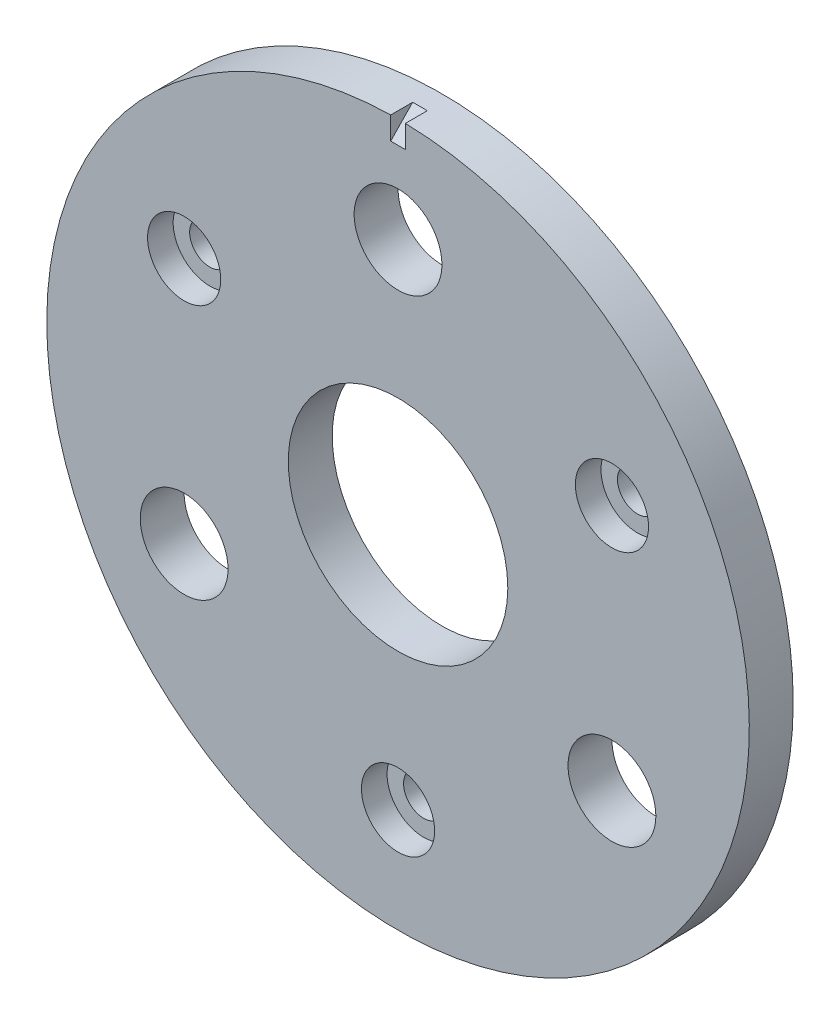
ISO-10303-21;
HEADER;
FILE_DESCRIPTION(('STEP AP214'),'2;1');
FILE_NAME('part.step','',(''),(''),'','','');
FILE_SCHEMA(('AUTOMOTIVE_DESIGN { 1 0 10303 214 1 1 1 1 }'));
ENDSEC;
DATA;
#1=APPLICATION_CONTEXT('core data for automotive mechanical design processes');
#2=APPLICATION_PROTOCOL_DEFINITION('international standard','automotive_design',2000,#1);
#3=PRODUCT_CONTEXT('',#1,'mechanical');
#4=PRODUCT('Part','Part','',(#3));
#5=PRODUCT_RELATED_PRODUCT_CATEGORY('part','',(#4));
#6=PRODUCT_DEFINITION_FORMATION('','',#4);
#7=PRODUCT_DEFINITION_CONTEXT('part definition',#1,'design');
#8=PRODUCT_DEFINITION('design','',#6,#7);
#9=PRODUCT_DEFINITION_SHAPE('','',#8);
#10=(LENGTH_UNIT() NAMED_UNIT(*) SI_UNIT(.MILLI.,.METRE.));
#11=(NAMED_UNIT(*) PLANE_ANGLE_UNIT() SI_UNIT($,.RADIAN.));
#12=(NAMED_UNIT(*) SI_UNIT($,.STERADIAN.) SOLID_ANGLE_UNIT());
#13=UNCERTAINTY_MEASURE_WITH_UNIT(LENGTH_MEASURE(1.E-05),#10,'distance_accuracy_value','');
#14=(GEOMETRIC_REPRESENTATION_CONTEXT(3) GLOBAL_UNCERTAINTY_ASSIGNED_CONTEXT((#13)) GLOBAL_UNIT_ASSIGNED_CONTEXT((#10,
#11,#12)) REPRESENTATION_CONTEXT('',''));
#15=CARTESIAN_POINT('',(0.,0.,0.));
#16=DIRECTION('',(0.,0.,1.));
#17=DIRECTION('',(1.,0.,0.));
#18=AXIS2_PLACEMENT_3D('',#15,#16,#17);
#19=CARTESIAN_POINT('',(0.,-33.75,3.16530031758062));
#20=DIRECTION('',(0.,0.,-1.));
#21=DIRECTION('',(-1.,0.,0.));
#22=AXIS2_PLACEMENT_3D('',#19,#20,#21);
#23=CYLINDRICAL_SURFACE('',#22,2.75);
#24=CARTESIAN_POINT('',(0.,-33.75,-3.));
#25=DIRECTION('',(0.,0.,1.));
#26=DIRECTION('',(1.,0.,0.));
#27=AXIS2_PLACEMENT_3D('',#24,#25,#26);
#28=CIRCLE('',#27,2.75);
#29=CARTESIAN_POINT('',(2.75,-33.75,-3.));
#30=VERTEX_POINT('',#29);
#31=EDGE_CURVE('E199',#30,#30,#28,.T.);
#32=ORIENTED_EDGE('',*,*,#31,.F.);
#33=EDGE_LOOP('',(#32));
#34=FACE_BOUND('',#33,.T.);
#35=CARTESIAN_POINT('',(0.,-33.75,-0.5));
#36=DIRECTION('',(0.,0.,1.));
#37=DIRECTION('',(1.,0.,0.));
#38=AXIS2_PLACEMENT_3D('',#35,#36,#37);
#39=CIRCLE('',#38,2.75);
#40=CARTESIAN_POINT('',(2.75,-33.75,-0.5));
#41=VERTEX_POINT('',#40);
#42=EDGE_CURVE('E44',#41,#41,#39,.T.);
#43=ORIENTED_EDGE('',*,*,#42,.T.);
#44=EDGE_LOOP('',(#43));
#45=FACE_BOUND('',#44,.T.);
#46=ADVANCED_FACE('F41',(#34,#45),#23,.F.);
#47=CARTESIAN_POINT('',(-29.228,16.875,3.16530031758062));
#48=DIRECTION('',(0.,0.,-1.));
#49=DIRECTION('',(-1.,0.,0.));
#50=AXIS2_PLACEMENT_3D('',#47,#48,#49);
#51=CYLINDRICAL_SURFACE('',#50,2.75);
#52=CARTESIAN_POINT('',(-29.228,16.875,-3.));
#53=DIRECTION('',(0.,0.,1.));
#54=DIRECTION('',(1.,0.,0.));
#55=AXIS2_PLACEMENT_3D('',#52,#53,#54);
#56=CIRCLE('',#55,2.75);
#57=CARTESIAN_POINT('',(-26.478,16.875,-3.));
#58=VERTEX_POINT('',#57);
#59=EDGE_CURVE('E182',#58,#58,#56,.T.);
#60=ORIENTED_EDGE('',*,*,#59,.F.);
#61=EDGE_LOOP('',(#60));
#62=FACE_BOUND('',#61,.T.);
#63=CARTESIAN_POINT('',(-29.228,16.875,-0.5));
#64=DIRECTION('',(0.,0.,1.));
#65=DIRECTION('',(1.,0.,0.));
#66=AXIS2_PLACEMENT_3D('',#63,#64,#65);
#67=CIRCLE('',#66,2.75);
#68=CARTESIAN_POINT('',(-26.478,16.875,-0.5));
#69=VERTEX_POINT('',#68);
#70=EDGE_CURVE('E172',#69,#69,#67,.T.);
#71=ORIENTED_EDGE('',*,*,#70,.T.);
#72=EDGE_LOOP('',(#71));
#73=FACE_BOUND('',#72,.T.);
#74=ADVANCED_FACE('F222',(#62,#73),#51,.F.);
#75=CARTESIAN_POINT('',(29.228,16.875,3.16530031758062));
#76=DIRECTION('',(0.,0.,-1.));
#77=DIRECTION('',(-1.,0.,0.));
#78=AXIS2_PLACEMENT_3D('',#75,#76,#77);
#79=CYLINDRICAL_SURFACE('',#78,2.75);
#80=CARTESIAN_POINT('',(29.228,16.875,-3.));
#81=DIRECTION('',(0.,0.,1.));
#82=DIRECTION('',(1.,0.,0.));
#83=AXIS2_PLACEMENT_3D('',#80,#81,#82);
#84=CIRCLE('',#83,2.75);
#85=CARTESIAN_POINT('',(31.978,16.875,-3.));
#86=VERTEX_POINT('',#85);
#87=EDGE_CURVE('E186',#86,#86,#84,.T.);
#88=ORIENTED_EDGE('',*,*,#87,.F.);
#89=EDGE_LOOP('',(#88));
#90=FACE_BOUND('',#89,.T.);
#91=CARTESIAN_POINT('',(29.228,16.875,-0.5));
#92=DIRECTION('',(0.,0.,1.));
#93=DIRECTION('',(1.,0.,0.));
#94=AXIS2_PLACEMENT_3D('',#91,#92,#93);
#95=CIRCLE('',#94,2.75);
#96=CARTESIAN_POINT('',(31.978,16.875,-0.5));
#97=VERTEX_POINT('',#96);
#98=EDGE_CURVE('E171',#97,#97,#95,.T.);
#99=ORIENTED_EDGE('',*,*,#98,.T.);
#100=EDGE_LOOP('',(#99));
#101=FACE_BOUND('',#100,.T.);
#102=ADVANCED_FACE('F147',(#90,#101),#79,.F.);
#103=CARTESIAN_POINT('',(0.,0.,3.));
#104=DIRECTION('',(0.,0.,1.));
#105=DIRECTION('',(1.,0.,0.));
#106=AXIS2_PLACEMENT_3D('',#103,#104,#105);
#107=PLANE('',#106);
#108=CARTESIAN_POINT('',(0.,-33.75,3.));
#109=DIRECTION('',(0.,0.,1.));
#110=DIRECTION('',(1.,0.,0.));
#111=AXIS2_PLACEMENT_3D('',#108,#109,#110);
#112=CIRCLE('',#111,5.);
#113=CARTESIAN_POINT('',(5.,-33.75,3.));
#114=VERTEX_POINT('',#113);
#115=EDGE_CURVE('E379',#114,#114,#112,.T.);
#116=ORIENTED_EDGE('',*,*,#115,.F.);
#117=EDGE_LOOP('',(#116));
#118=FACE_BOUND('',#117,.T.);
#119=CARTESIAN_POINT('',(29.228,16.875,3.));
#120=DIRECTION('',(0.,0.,1.));
#121=DIRECTION('',(1.,0.,0.));
#122=AXIS2_PLACEMENT_3D('',#119,#120,#121);
#123=CIRCLE('',#122,5.);
#124=CARTESIAN_POINT('',(34.228,16.875,3.));
#125=VERTEX_POINT('',#124);
#126=EDGE_CURVE('E383',#125,#125,#123,.T.);
#127=ORIENTED_EDGE('',*,*,#126,.F.);
#128=EDGE_LOOP('',(#127));
#129=FACE_BOUND('',#128,.T.);
#130=CARTESIAN_POINT('',(-29.228,16.875,3.));
#131=DIRECTION('',(0.,0.,1.));
#132=DIRECTION('',(1.,0.,0.));
#133=AXIS2_PLACEMENT_3D('',#130,#131,#132);
#134=CIRCLE('',#133,5.);
#135=CARTESIAN_POINT('',(-24.228,16.875,3.));
#136=VERTEX_POINT('',#135);
#137=EDGE_CURVE('E392',#136,#136,#134,.T.);
#138=ORIENTED_EDGE('',*,*,#137,.F.);
#139=EDGE_LOOP('',(#138));
#140=FACE_BOUND('',#139,.T.);
#141=CARTESIAN_POINT('',(0.,0.,3.));
#142=DIRECTION('',(0.,0.,1.));
#143=DIRECTION('',(1.,0.,0.));
#144=AXIS2_PLACEMENT_3D('',#141,#142,#143);
#145=CIRCLE('',#144,15.);
#146=CARTESIAN_POINT('',(15.,0.,3.));
#147=VERTEX_POINT('',#146);
#148=EDGE_CURVE('E168',#147,#147,#145,.F.);
#149=ORIENTED_EDGE('',*,*,#148,.T.);
#150=EDGE_LOOP('',(#149));
#151=FACE_BOUND('',#150,.T.);
#152=CARTESIAN_POINT('',(-29.2283573777247,-16.8750000000001,3.));
#153=DIRECTION('',(0.,0.,1.));
#154=DIRECTION('',(1.,0.,0.));
#155=AXIS2_PLACEMENT_3D('',#152,#153,#154);
#156=CIRCLE('',#155,6.);
#157=CARTESIAN_POINT('',(-23.2283573777247,-16.8750000000001,3.));
#158=VERTEX_POINT('',#157);
#159=EDGE_CURVE('E113',#158,#158,#156,.T.);
#160=ORIENTED_EDGE('',*,*,#159,.F.);
#161=EDGE_LOOP('',(#160));
#162=FACE_BOUND('',#161,.T.);
#163=CARTESIAN_POINT('',(29.228357377725,-16.8749999999997,3.));
#164=DIRECTION('',(0.,0.,1.));
#165=DIRECTION('',(1.,0.,0.));
#166=AXIS2_PLACEMENT_3D('',#163,#164,#165);
#167=CIRCLE('',#166,6.);
#168=CARTESIAN_POINT('',(35.228357377725,-16.8749999999997,3.));
#169=VERTEX_POINT('',#168);
#170=EDGE_CURVE('E108',#169,#169,#167,.T.);
#171=ORIENTED_EDGE('',*,*,#170,.F.);
#172=EDGE_LOOP('',(#171));
#173=FACE_BOUND('',#172,.T.);
#174=CARTESIAN_POINT('',(0.,33.75,3.000012));
#175=DIRECTION('',(0.,0.,1.));
#176=DIRECTION('',(1.,0.,0.));
#177=AXIS2_PLACEMENT_3D('',#174,#175,#176);
#178=CIRCLE('',#177,6.);
#179=CARTESIAN_POINT('',(6.,33.75,3.000012));
#180=VERTEX_POINT('',#179);
#181=EDGE_CURVE('E120',#180,#180,#178,.T.);
#182=ORIENTED_EDGE('',*,*,#181,.F.);
#183=EDGE_LOOP('',(#182));
#184=FACE_BOUND('',#183,.T.);
#185=CARTESIAN_POINT('',(0.,0.,3.));
#186=DIRECTION('',(0.,0.,1.));
#187=DIRECTION('',(1.,0.,0.));
#188=AXIS2_PLACEMENT_3D('',#185,#186,#187);
#189=CIRCLE('',#188,48.);
#190=CARTESIAN_POINT('',(-0.999999999999999,47.9895822028073,3.));
#191=VERTEX_POINT('',#190);
#192=CARTESIAN_POINT('',(1.,47.9895822028073,3.));
#193=VERTEX_POINT('',#192);
#194=EDGE_CURVE('E134',#191,#193,#189,.T.);
#195=ORIENTED_EDGE('',*,*,#194,.T.);
#196=DIRECTION('',(0.,-1.,0.));
#197=VECTOR('',#196,1.);
#198=CARTESIAN_POINT('',(1.,44.8892530056158,3.));
#199=LINE('',#198,#197);
#200=CARTESIAN_POINT('',(1.,44.8892530056158,3.));
#201=VERTEX_POINT('',#200);
#202=EDGE_CURVE('E56',#193,#201,#199,.T.);
#203=ORIENTED_EDGE('',*,*,#202,.T.);
#204=DIRECTION('',(1.,0.,0.));
#205=VECTOR('',#204,1.);
#206=CARTESIAN_POINT('',(-0.999999999999995,44.8892530056158,3.));
#207=LINE('',#206,#205);
#208=CARTESIAN_POINT('',(-0.999999999999995,44.8892530056158,3.));
#209=VERTEX_POINT('',#208);
#210=EDGE_CURVE('E87',#209,#201,#207,.T.);
#211=ORIENTED_EDGE('',*,*,#210,.F.);
#212=DIRECTION('',(0.,-1.,0.));
#213=VECTOR('',#212,1.);
#214=CARTESIAN_POINT('',(-0.999999999999995,44.8892530056158,3.));
#215=LINE('',#214,#213);
#216=EDGE_CURVE('E77',#191,#209,#215,.T.);
#217=ORIENTED_EDGE('',*,*,#216,.F.);
#218=EDGE_LOOP('',(#195,#203,#211,#217));
#219=FACE_BOUND('',#218,.T.);
#220=ADVANCED_FACE('F94',(#118,#129,#140,#151,#162,#173,#184,#219),#107,.T.);
#221=CARTESIAN_POINT('',(0.,0.,-3.));
#222=DIRECTION('',(0.,0.,1.));
#223=DIRECTION('',(1.,0.,0.));
#224=AXIS2_PLACEMENT_3D('',#221,#222,#223);
#225=PLANE('',#224);
#226=ORIENTED_EDGE('',*,*,#87,.T.);
#227=EDGE_LOOP('',(#226));
#228=FACE_BOUND('',#227,.T.);
#229=ORIENTED_EDGE('',*,*,#59,.T.);
#230=EDGE_LOOP('',(#229));
#231=FACE_BOUND('',#230,.T.);
#232=CARTESIAN_POINT('',(0.,0.,-3.));
#233=DIRECTION('',(0.,0.,1.));
#234=DIRECTION('',(1.,0.,0.));
#235=AXIS2_PLACEMENT_3D('',#232,#233,#234);
#236=CIRCLE('',#235,15.);
#237=CARTESIAN_POINT('',(15.,0.,-3.));
#238=VERTEX_POINT('',#237);
#239=EDGE_CURVE('E167',#238,#238,#236,.T.);
#240=ORIENTED_EDGE('',*,*,#239,.T.);
#241=EDGE_LOOP('',(#240));
#242=FACE_BOUND('',#241,.T.);
#243=ORIENTED_EDGE('',*,*,#31,.T.);
#244=EDGE_LOOP('',(#243));
#245=FACE_BOUND('',#244,.T.);
#246=CARTESIAN_POINT('',(-29.2283573777247,-16.8750000000001,-3.));
#247=DIRECTION('',(0.,0.,1.));
#248=DIRECTION('',(-0.500000000000004,0.866025403784437,0.));
#249=AXIS2_PLACEMENT_3D('',#246,#247,#248);
#250=CIRCLE('',#249,6.);
#251=CARTESIAN_POINT('',(-32.2283573777248,-11.6788475772935,-3.));
#252=VERTEX_POINT('',#251);
#253=EDGE_CURVE('E103',#252,#252,#250,.T.);
#254=ORIENTED_EDGE('',*,*,#253,.T.);
#255=EDGE_LOOP('',(#254));
#256=FACE_BOUND('',#255,.T.);
#257=CARTESIAN_POINT('',(29.228357377725,-16.8749999999997,-3.));
#258=DIRECTION('',(0.,0.,1.));
#259=DIRECTION('',(-0.499999999999992,-0.866025403784444,0.));
#260=AXIS2_PLACEMENT_3D('',#257,#258,#259);
#261=CIRCLE('',#260,6.);
#262=CARTESIAN_POINT('',(26.228357377725,-22.0711524227064,-3.));
#263=VERTEX_POINT('',#262);
#264=EDGE_CURVE('E98',#263,#263,#261,.T.);
#265=ORIENTED_EDGE('',*,*,#264,.T.);
#266=EDGE_LOOP('',(#265));
#267=FACE_BOUND('',#266,.T.);
#268=CARTESIAN_POINT('',(0.,33.75,-3.));
#269=DIRECTION('',(0.,0.,1.));
#270=DIRECTION('',(1.,0.,0.));
#271=AXIS2_PLACEMENT_3D('',#268,#269,#270);
#272=CIRCLE('',#271,6.);
#273=CARTESIAN_POINT('',(6.,33.75,-3.));
#274=VERTEX_POINT('',#273);
#275=EDGE_CURVE('E117',#274,#274,#272,.T.);
#276=ORIENTED_EDGE('',*,*,#275,.T.);
#277=EDGE_LOOP('',(#276));
#278=FACE_BOUND('',#277,.T.);
#279=CARTESIAN_POINT('',(0.,0.,-3.));
#280=DIRECTION('',(0.,0.,1.));
#281=DIRECTION('',(1.,0.,0.));
#282=AXIS2_PLACEMENT_3D('',#279,#280,#281);
#283=CIRCLE('',#282,48.);
#284=CARTESIAN_POINT('',(48.,0.,-3.));
#285=VERTEX_POINT('',#284);
#286=EDGE_CURVE('E125',#285,#285,#283,.T.);
#287=ORIENTED_EDGE('',*,*,#286,.F.);
#288=EDGE_LOOP('',(#287));
#289=FACE_BOUND('',#288,.T.);
#290=ADVANCED_FACE('F146',(#228,#231,#242,#245,#256,#267,#278,#289),#225,.F.);
#291=CARTESIAN_POINT('',(0.,0.,3.));
#292=DIRECTION('',(0.,0.,-1.));
#293=DIRECTION('',(-1.,0.,0.));
#294=AXIS2_PLACEMENT_3D('',#291,#292,#293);
#295=CYLINDRICAL_SURFACE('',#294,48.);
#296=DIRECTION('',(0.,0.,-1.));
#297=VECTOR('',#296,1.);
#298=CARTESIAN_POINT('',(-0.999999999999999,47.9895822028073,3.));
#299=LINE('',#298,#297);
#300=CARTESIAN_POINT('',(-1.,47.9895822028073,0.010046908872529));
#301=VERTEX_POINT('',#300);
#302=EDGE_CURVE('E11',#301,#191,#299,.F.);
#303=ORIENTED_EDGE('',*,*,#302,.F.);
#304=CARTESIAN_POINT('',(0.,0.,46.2911320849816));
#305=DIRECTION('',(0.,-0.694177668503908,-0.719803698622395));
#306=DIRECTION('',(0.,0.719803698622395,-0.694177668503907));
#307=AXIS2_PLACEMENT_3D('',#304,#305,#306);
#308=ELLIPSE('',#307,66.6848476770339,48.);
#309=CARTESIAN_POINT('',(0.999999999999998,47.9895822028073,0.010046908872529));
#310=VERTEX_POINT('',#309);
#311=EDGE_CURVE('E51',#301,#310,#308,.T.);
#312=ORIENTED_EDGE('',*,*,#311,.T.);
#313=DIRECTION('',(0.,0.,-1.));
#314=VECTOR('',#313,1.);
#315=CARTESIAN_POINT('',(1.,47.9895822028073,3.));
#316=LINE('',#315,#314);
#317=EDGE_CURVE('E158',#310,#193,#316,.F.);
#318=ORIENTED_EDGE('',*,*,#317,.T.);
#319=ORIENTED_EDGE('',*,*,#194,.F.);
#320=EDGE_LOOP('',(#303,#312,#318,#319));
#321=FACE_BOUND('',#320,.T.);
#322=ORIENTED_EDGE('',*,*,#286,.T.);
#323=EDGE_LOOP('',(#322));
#324=FACE_BOUND('',#323,.T.);
#325=ADVANCED_FACE('F43',(#321,#324),#295,.T.);
#326=CARTESIAN_POINT('',(0.,33.75,-3.));
#327=DIRECTION('',(0.,0.,1.));
#328=DIRECTION('',(1.,0.,0.));
#329=AXIS2_PLACEMENT_3D('',#326,#327,#328);
#330=CYLINDRICAL_SURFACE('',#329,6.);
#331=ORIENTED_EDGE('',*,*,#275,.F.);
#332=EDGE_LOOP('',(#331));
#333=FACE_BOUND('',#332,.T.);
#334=ORIENTED_EDGE('',*,*,#181,.T.);
#335=EDGE_LOOP('',(#334));
#336=FACE_BOUND('',#335,.T.);
#337=ADVANCED_FACE('F135',(#333,#336),#330,.F.);
#338=CARTESIAN_POINT('',(29.228357377725,-16.8749999999997,-3.));
#339=DIRECTION('',(0.,0.,1.));
#340=DIRECTION('',(1.,0.,0.));
#341=AXIS2_PLACEMENT_3D('',#338,#339,#340);
#342=CYLINDRICAL_SURFACE('',#341,6.);
#343=ORIENTED_EDGE('',*,*,#170,.T.);
#344=EDGE_LOOP('',(#343));
#345=FACE_BOUND('',#344,.T.);
#346=ORIENTED_EDGE('',*,*,#264,.F.);
#347=EDGE_LOOP('',(#346));
#348=FACE_BOUND('',#347,.T.);
#349=ADVANCED_FACE('F141',(#345,#348),#342,.F.);
#350=CARTESIAN_POINT('',(-29.2283573777247,-16.8750000000001,-3.));
#351=DIRECTION('',(0.,0.,1.));
#352=DIRECTION('',(1.,0.,0.));
#353=AXIS2_PLACEMENT_3D('',#350,#351,#352);
#354=CYLINDRICAL_SURFACE('',#353,6.);
#355=ORIENTED_EDGE('',*,*,#159,.T.);
#356=EDGE_LOOP('',(#355));
#357=FACE_BOUND('',#356,.T.);
#358=ORIENTED_EDGE('',*,*,#253,.F.);
#359=EDGE_LOOP('',(#358));
#360=FACE_BOUND('',#359,.T.);
#361=ADVANCED_FACE('F242',(#357,#360),#354,.F.);
#362=CARTESIAN_POINT('',(-1.,48.,0.));
#363=DIRECTION('',(0.,-0.694177668503908,-0.719803698622395));
#364=DIRECTION('',(0.,0.719803698622395,-0.694177668503907));
#365=AXIS2_PLACEMENT_3D('',#362,#363,#364);
#366=PLANE('',#365);
#367=ORIENTED_EDGE('',*,*,#311,.F.);
#368=DIRECTION('',(0.,0.719803698622395,-0.694177668503907));
#369=VECTOR('',#368,1.);
#370=CARTESIAN_POINT('',(-1.,48.,0.));
#371=LINE('',#370,#369);
#372=EDGE_CURVE('E79',#209,#301,#371,.T.);
#373=ORIENTED_EDGE('',*,*,#372,.F.);
#374=ORIENTED_EDGE('',*,*,#210,.T.);
#375=DIRECTION('',(0.,0.719803698622395,-0.694177668503907));
#376=VECTOR('',#375,1.);
#377=CARTESIAN_POINT('',(0.999999999999998,48.,0.));
#378=LINE('',#377,#376);
#379=EDGE_CURVE('E84',#201,#310,#378,.T.);
#380=ORIENTED_EDGE('',*,*,#379,.T.);
#381=EDGE_LOOP('',(#367,#373,#374,#380));
#382=FACE_BOUND('',#381,.T.);
#383=ADVANCED_FACE('F90',(#382),#366,.F.);
#384=CARTESIAN_POINT('',(-1.,0.,0.));
#385=DIRECTION('',(1.,0.,0.));
#386=DIRECTION('',(0.,0.,-1.));
#387=AXIS2_PLACEMENT_3D('',#384,#385,#386);
#388=PLANE('',#387);
#389=ORIENTED_EDGE('',*,*,#302,.T.);
#390=ORIENTED_EDGE('',*,*,#216,.T.);
#391=ORIENTED_EDGE('',*,*,#372,.T.);
#392=EDGE_LOOP('',(#389,#390,#391));
#393=FACE_BOUND('',#392,.T.);
#394=ADVANCED_FACE('F76',(#393),#388,.T.);
#395=CARTESIAN_POINT('',(1.,0.,0.));
#396=DIRECTION('',(1.,0.,0.));
#397=DIRECTION('',(0.,0.,-1.));
#398=AXIS2_PLACEMENT_3D('',#395,#396,#397);
#399=PLANE('',#398);
#400=ORIENTED_EDGE('',*,*,#379,.F.);
#401=ORIENTED_EDGE('',*,*,#202,.F.);
#402=ORIENTED_EDGE('',*,*,#317,.F.);
#403=EDGE_LOOP('',(#400,#401,#402));
#404=FACE_BOUND('',#403,.T.);
#405=ADVANCED_FACE('F239',(#404),#399,.F.);
#406=CARTESIAN_POINT('',(0.,0.,3.16530031758062));
#407=DIRECTION('',(0.,0.,-1.));
#408=DIRECTION('',(-1.,0.,0.));
#409=AXIS2_PLACEMENT_3D('',#406,#407,#408);
#410=CYLINDRICAL_SURFACE('',#409,15.);
#411=ORIENTED_EDGE('',*,*,#148,.F.);
#412=EDGE_LOOP('',(#411));
#413=FACE_BOUND('',#412,.T.);
#414=ORIENTED_EDGE('',*,*,#239,.F.);
#415=EDGE_LOOP('',(#414));
#416=FACE_BOUND('',#415,.T.);
#417=ADVANCED_FACE('F240',(#413,#416),#410,.F.);
#418=CARTESIAN_POINT('',(29.228,16.875,-0.5));
#419=DIRECTION('',(0.,0.,1.));
#420=DIRECTION('',(1.,0.,0.));
#421=AXIS2_PLACEMENT_3D('',#418,#419,#420);
#422=CYLINDRICAL_SURFACE('',#421,5.);
#423=CARTESIAN_POINT('',(29.228,16.875,-0.5));
#424=DIRECTION('',(0.,0.,1.));
#425=DIRECTION('',(1.,0.,0.));
#426=AXIS2_PLACEMENT_3D('',#423,#424,#425);
#427=CIRCLE('',#426,5.);
#428=CARTESIAN_POINT('',(34.228,16.875,-0.5));
#429=VERTEX_POINT('',#428);
#430=EDGE_CURVE('E394',#429,#429,#427,.T.);
#431=ORIENTED_EDGE('',*,*,#430,.F.);
#432=EDGE_LOOP('',(#431));
#433=FACE_BOUND('',#432,.T.);
#434=ORIENTED_EDGE('',*,*,#126,.T.);
#435=EDGE_LOOP('',(#434));
#436=FACE_BOUND('',#435,.T.);
#437=ADVANCED_FACE('F310',(#433,#436),#422,.F.);
#438=CARTESIAN_POINT('',(29.228,16.875,-0.5));
#439=DIRECTION('',(0.,0.,1.));
#440=DIRECTION('',(1.,0.,0.));
#441=AXIS2_PLACEMENT_3D('',#438,#439,#440);
#442=PLANE('',#441);
#443=ORIENTED_EDGE('',*,*,#98,.F.);
#444=EDGE_LOOP('',(#443));
#445=FACE_BOUND('',#444,.T.);
#446=ORIENTED_EDGE('',*,*,#430,.T.);
#447=EDGE_LOOP('',(#446));
#448=FACE_BOUND('',#447,.T.);
#449=ADVANCED_FACE('F334',(#445,#448),#442,.T.);
#450=CARTESIAN_POINT('',(-29.228,16.875,-0.5));
#451=DIRECTION('',(0.,0.,1.));
#452=DIRECTION('',(1.,0.,0.));
#453=AXIS2_PLACEMENT_3D('',#450,#451,#452);
#454=CYLINDRICAL_SURFACE('',#453,5.);
#455=CARTESIAN_POINT('',(-29.228,16.875,-0.5));
#456=DIRECTION('',(0.,0.,1.));
#457=DIRECTION('',(1.,0.,0.));
#458=AXIS2_PLACEMENT_3D('',#455,#456,#457);
#459=CIRCLE('',#458,5.);
#460=CARTESIAN_POINT('',(-24.228,16.875,-0.5));
#461=VERTEX_POINT('',#460);
#462=EDGE_CURVE('E396',#461,#461,#459,.T.);
#463=ORIENTED_EDGE('',*,*,#462,.F.);
#464=EDGE_LOOP('',(#463));
#465=FACE_BOUND('',#464,.T.);
#466=ORIENTED_EDGE('',*,*,#137,.T.);
#467=EDGE_LOOP('',(#466));
#468=FACE_BOUND('',#467,.T.);
#469=ADVANCED_FACE('F345',(#465,#468),#454,.F.);
#470=CARTESIAN_POINT('',(-29.228,16.875,-0.5));
#471=DIRECTION('',(0.,0.,1.));
#472=DIRECTION('',(1.,0.,0.));
#473=AXIS2_PLACEMENT_3D('',#470,#471,#472);
#474=PLANE('',#473);
#475=ORIENTED_EDGE('',*,*,#70,.F.);
#476=EDGE_LOOP('',(#475));
#477=FACE_BOUND('',#476,.T.);
#478=ORIENTED_EDGE('',*,*,#462,.T.);
#479=EDGE_LOOP('',(#478));
#480=FACE_BOUND('',#479,.T.);
#481=ADVANCED_FACE('F347',(#477,#480),#474,.T.);
#482=CARTESIAN_POINT('',(0.,-33.75,-0.5));
#483=DIRECTION('',(0.,0.,1.));
#484=DIRECTION('',(1.,0.,0.));
#485=AXIS2_PLACEMENT_3D('',#482,#483,#484);
#486=CYLINDRICAL_SURFACE('',#485,5.);
#487=CARTESIAN_POINT('',(0.,-33.75,-0.5));
#488=DIRECTION('',(0.,0.,1.));
#489=DIRECTION('',(1.,0.,0.));
#490=AXIS2_PLACEMENT_3D('',#487,#488,#489);
#491=CIRCLE('',#490,5.);
#492=CARTESIAN_POINT('',(5.,-33.75,-0.5));
#493=VERTEX_POINT('',#492);
#494=EDGE_CURVE('E174',#493,#493,#491,.T.);
#495=ORIENTED_EDGE('',*,*,#494,.F.);
#496=EDGE_LOOP('',(#495));
#497=FACE_BOUND('',#496,.T.);
#498=ORIENTED_EDGE('',*,*,#115,.T.);
#499=EDGE_LOOP('',(#498));
#500=FACE_BOUND('',#499,.T.);
#501=ADVANCED_FACE('F356',(#497,#500),#486,.F.);
#502=CARTESIAN_POINT('',(0.,-33.75,-0.5));
#503=DIRECTION('',(0.,0.,1.));
#504=DIRECTION('',(1.,0.,0.));
#505=AXIS2_PLACEMENT_3D('',#502,#503,#504);
#506=PLANE('',#505);
#507=ORIENTED_EDGE('',*,*,#42,.F.);
#508=EDGE_LOOP('',(#507));
#509=FACE_BOUND('',#508,.T.);
#510=ORIENTED_EDGE('',*,*,#494,.T.);
#511=EDGE_LOOP('',(#510));
#512=FACE_BOUND('',#511,.T.);
#513=ADVANCED_FACE('F366',(#509,#512),#506,.T.);
#514=CLOSED_SHELL('',(#46,#74,#102,#220,#290,#325,#337,#349,#361,#383,#394,#405,#417,#437,#449,
#469,#481,#501,#513));
#515=MANIFOLD_SOLID_BREP('B2',#514);
#516=ADVANCED_BREP_SHAPE_REPRESENTATION('',(#18,#515),#14);
#517=SHAPE_DEFINITION_REPRESENTATION(#9,#516);
ENDSEC;
END-ISO-10303-21;
